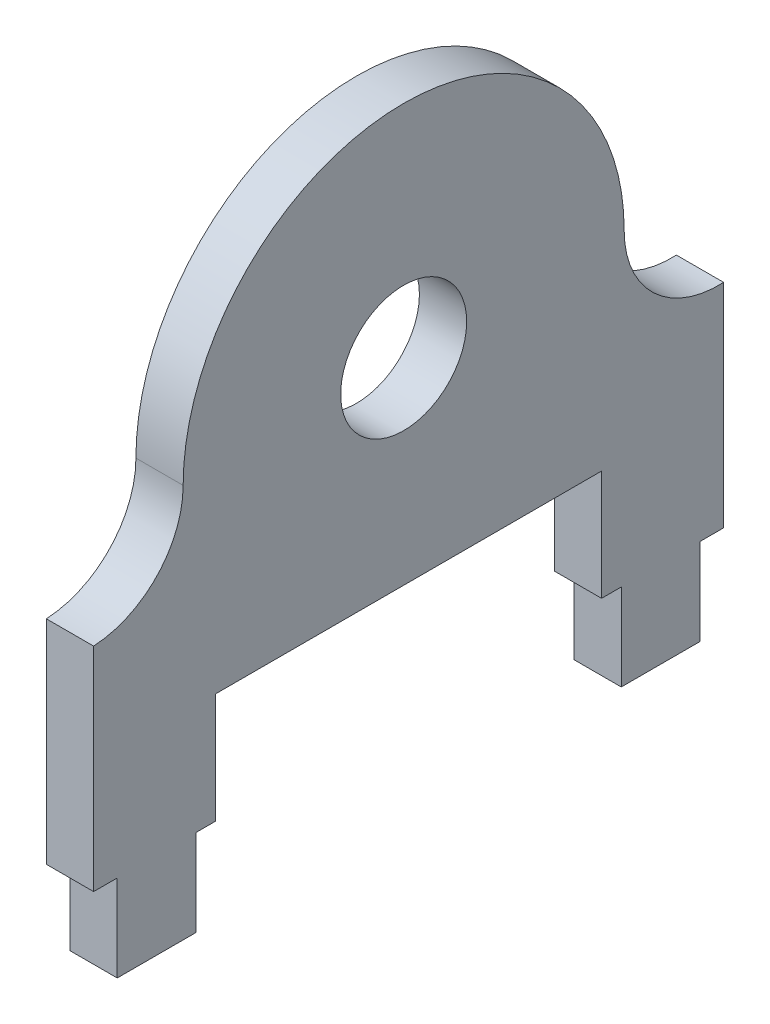
ISO-10303-21;
HEADER;
FILE_DESCRIPTION(('STEP AP214'),'2;1');
FILE_NAME('part.step','',(''),(''),'','','');
FILE_SCHEMA(('AUTOMOTIVE_DESIGN { 1 0 10303 214 1 1 1 1 }'));
ENDSEC;
DATA;
#1=APPLICATION_CONTEXT('core data for automotive mechanical design processes');
#2=APPLICATION_PROTOCOL_DEFINITION('international standard','automotive_design',2000,#1);
#3=PRODUCT_CONTEXT('',#1,'mechanical');
#4=PRODUCT('Part','Part','',(#3));
#5=PRODUCT_RELATED_PRODUCT_CATEGORY('part','',(#4));
#6=PRODUCT_DEFINITION_FORMATION('','',#4);
#7=PRODUCT_DEFINITION_CONTEXT('part definition',#1,'design');
#8=PRODUCT_DEFINITION('design','',#6,#7);
#9=PRODUCT_DEFINITION_SHAPE('','',#8);
#10=(LENGTH_UNIT() NAMED_UNIT(*) SI_UNIT(.MILLI.,.METRE.));
#11=(NAMED_UNIT(*) PLANE_ANGLE_UNIT() SI_UNIT($,.RADIAN.));
#12=(NAMED_UNIT(*) SI_UNIT($,.STERADIAN.) SOLID_ANGLE_UNIT());
#13=UNCERTAINTY_MEASURE_WITH_UNIT(LENGTH_MEASURE(1.E-05),#10,'distance_accuracy_value','');
#14=(GEOMETRIC_REPRESENTATION_CONTEXT(3) GLOBAL_UNCERTAINTY_ASSIGNED_CONTEXT((#13)) GLOBAL_UNIT_ASSIGNED_CONTEXT((#10,
#11,#12)) REPRESENTATION_CONTEXT('',''));
#15=CARTESIAN_POINT('',(0.,0.,0.));
#16=DIRECTION('',(0.,0.,1.));
#17=DIRECTION('',(1.,0.,0.));
#18=AXIS2_PLACEMENT_3D('',#15,#16,#17);
#19=CARTESIAN_POINT('',(3.,5.82382171329766,17.1432323268708));
#20=DIRECTION('',(1.,0.,0.));
#21=DIRECTION('',(0.,0.,-1.));
#22=AXIS2_PLACEMENT_3D('',#19,#20,#21);
#23=PLANE('',#22);
#24=CARTESIAN_POINT('',(3.,5.82382171329766,17.1432323268708));
#25=DIRECTION('',(-1.,0.,0.));
#26=DIRECTION('',(0.,0.,-1.));
#27=AXIS2_PLACEMENT_3D('',#24,#25,#26);
#28=CIRCLE('',#27,6.);
#29=CARTESIAN_POINT('',(3.,5.82630206498001,11.1432328395495));
#30=VERTEX_POINT('',#29);
#31=CARTESIAN_POINT('',(3.,-0.16791044776119,16.8283582089552));
#32=VERTEX_POINT('',#31);
#33=EDGE_CURVE('E234',#30,#32,#28,.T.);
#34=ORIENTED_EDGE('',*,*,#33,.T.);
#35=DIRECTION('',(0.,-1.,0.));
#36=VECTOR('',#35,1.);
#37=CARTESIAN_POINT('',(3.,-0.16791044776119,16.8283582089552));
#38=LINE('',#37,#36);
#39=CARTESIAN_POINT('',(3.,-13.6679104477612,16.8283582089552));
#40=VERTEX_POINT('',#39);
#41=EDGE_CURVE('E132',#32,#40,#38,.T.);
#42=ORIENTED_EDGE('',*,*,#41,.T.);
#43=DIRECTION('',(0.,0.,-1.));
#44=VECTOR('',#43,1.);
#45=CARTESIAN_POINT('',(3.,-13.6679104477612,16.8283582089552));
#46=LINE('',#45,#44);
#47=CARTESIAN_POINT('',(3.,-13.6679104477612,15.3283582089552));
#48=VERTEX_POINT('',#47);
#49=EDGE_CURVE('E279',#40,#48,#46,.T.);
#50=ORIENTED_EDGE('',*,*,#49,.T.);
#51=DIRECTION('',(0.,-1.,0.));
#52=VECTOR('',#51,1.);
#53=CARTESIAN_POINT('',(3.,-13.6679104477612,15.3283582089552));
#54=LINE('',#53,#52);
#55=CARTESIAN_POINT('',(3.,-19.1679104477612,15.3283582089552));
#56=VERTEX_POINT('',#55);
#57=EDGE_CURVE('E298',#48,#56,#54,.T.);
#58=ORIENTED_EDGE('',*,*,#57,.T.);
#59=DIRECTION('',(0.,0.,-1.));
#60=VECTOR('',#59,1.);
#61=CARTESIAN_POINT('',(3.,-19.1679104477612,15.3283582089552));
#62=LINE('',#61,#60);
#63=CARTESIAN_POINT('',(3.,-19.1679104477612,10.3283582089552));
#64=VERTEX_POINT('',#63);
#65=EDGE_CURVE('E295',#56,#64,#62,.T.);
#66=ORIENTED_EDGE('',*,*,#65,.T.);
#67=DIRECTION('',(0.,1.,0.));
#68=VECTOR('',#67,1.);
#69=CARTESIAN_POINT('',(3.,-19.1679104477612,10.3283582089552));
#70=LINE('',#69,#68);
#71=CARTESIAN_POINT('',(3.,-13.6679104477612,10.3283582089552));
#72=VERTEX_POINT('',#71);
#73=EDGE_CURVE('E297',#64,#72,#70,.T.);
#74=ORIENTED_EDGE('',*,*,#73,.T.);
#75=DIRECTION('',(0.,0.,-1.));
#76=VECTOR('',#75,1.);
#77=CARTESIAN_POINT('',(3.,-13.6679104477612,10.3283582089552));
#78=LINE('',#77,#76);
#79=CARTESIAN_POINT('',(3.,-13.6679104477612,9.07835820895524));
#80=VERTEX_POINT('',#79);
#81=EDGE_CURVE('E300',#72,#80,#78,.T.);
#82=ORIENTED_EDGE('',*,*,#81,.T.);
#83=DIRECTION('',(0.,1.,0.));
#84=VECTOR('',#83,1.);
#85=CARTESIAN_POINT('',(3.,-13.6679104477612,9.07835820895524));
#86=LINE('',#85,#84);
#87=CARTESIAN_POINT('',(3.,-6.66791044776119,9.07835820895524));
#88=VERTEX_POINT('',#87);
#89=EDGE_CURVE('E306',#80,#88,#86,.T.);
#90=ORIENTED_EDGE('',*,*,#89,.T.);
#91=DIRECTION('',(0.,0.,-1.));
#92=VECTOR('',#91,1.);
#93=CARTESIAN_POINT('',(3.,-6.66791044776119,9.07835820895524));
#94=LINE('',#93,#92);
#95=CARTESIAN_POINT('',(3.,-6.66791044776119,-15.4216417910448));
#96=VERTEX_POINT('',#95);
#97=EDGE_CURVE('E308',#88,#96,#94,.T.);
#98=ORIENTED_EDGE('',*,*,#97,.T.);
#99=DIRECTION('',(0.,-1.,0.));
#100=VECTOR('',#99,1.);
#101=CARTESIAN_POINT('',(3.,-6.66791044776119,-15.4216417910448));
#102=LINE('',#101,#100);
#103=CARTESIAN_POINT('',(3.,-13.6679104477612,-15.4216417910448));
#104=VERTEX_POINT('',#103);
#105=EDGE_CURVE('E310',#96,#104,#102,.T.);
#106=ORIENTED_EDGE('',*,*,#105,.T.);
#107=DIRECTION('',(0.,0.,-1.));
#108=VECTOR('',#107,1.);
#109=CARTESIAN_POINT('',(3.,-13.6679104477612,-15.4216417910448));
#110=LINE('',#109,#108);
#111=CARTESIAN_POINT('',(3.,-13.6679104477612,-16.6716417910448));
#112=VERTEX_POINT('',#111);
#113=EDGE_CURVE('E312',#104,#112,#110,.T.);
#114=ORIENTED_EDGE('',*,*,#113,.T.);
#115=DIRECTION('',(0.,-1.,0.));
#116=VECTOR('',#115,1.);
#117=CARTESIAN_POINT('',(3.,-13.6679104477612,-16.6716417910448));
#118=LINE('',#117,#116);
#119=CARTESIAN_POINT('',(3.,-19.1679104477612,-16.6716417910448));
#120=VERTEX_POINT('',#119);
#121=EDGE_CURVE('E314',#112,#120,#118,.T.);
#122=ORIENTED_EDGE('',*,*,#121,.T.);
#123=DIRECTION('',(0.,0.,-1.));
#124=VECTOR('',#123,1.);
#125=CARTESIAN_POINT('',(3.,-19.1679104477612,-16.6716417910448));
#126=LINE('',#125,#124);
#127=CARTESIAN_POINT('',(3.,-19.1679104477612,-21.6716417910448));
#128=VERTEX_POINT('',#127);
#129=EDGE_CURVE('E316',#120,#128,#126,.T.);
#130=ORIENTED_EDGE('',*,*,#129,.T.);
#131=DIRECTION('',(0.,1.,0.));
#132=VECTOR('',#131,1.);
#133=CARTESIAN_POINT('',(3.,-19.1679104477612,-21.6716417910448));
#134=LINE('',#133,#132);
#135=CARTESIAN_POINT('',(3.,-13.6679104477612,-21.6716417910448));
#136=VERTEX_POINT('',#135);
#137=EDGE_CURVE('E318',#128,#136,#134,.T.);
#138=ORIENTED_EDGE('',*,*,#137,.T.);
#139=DIRECTION('',(0.,0.,-1.));
#140=VECTOR('',#139,1.);
#141=CARTESIAN_POINT('',(3.,-13.6679104477612,-21.6716417910448));
#142=LINE('',#141,#140);
#143=CARTESIAN_POINT('',(3.,-13.6679104477612,-23.1716417910448));
#144=VERTEX_POINT('',#143);
#145=EDGE_CURVE('E181',#136,#144,#142,.T.);
#146=ORIENTED_EDGE('',*,*,#145,.T.);
#147=DIRECTION('',(0.,1.,0.));
#148=VECTOR('',#147,1.);
#149=CARTESIAN_POINT('',(3.,-13.6679104477612,-23.1716417910448));
#150=LINE('',#149,#148);
#151=CARTESIAN_POINT('',(3.,-0.16791044776119,-23.1716417910448));
#152=VERTEX_POINT('',#151);
#153=EDGE_CURVE('E175',#144,#152,#150,.T.);
#154=ORIENTED_EDGE('',*,*,#153,.T.);
#155=CARTESIAN_POINT('',(3.,5.83208955223879,-22.8646162204086));
#156=DIRECTION('',(-1.,0.,0.));
#157=DIRECTION('',(0.,0.,1.));
#158=AXIS2_PLACEMENT_3D('',#155,#156,#157);
#159=CIRCLE('',#158,6.00785025620848);
#160=CARTESIAN_POINT('',(3.,5.83208955223879,-16.8567659642001));
#161=VERTEX_POINT('',#160);
#162=EDGE_CURVE('E179',#152,#161,#159,.T.);
#163=ORIENTED_EDGE('',*,*,#162,.T.);
#164=CARTESIAN_POINT('',(3.,5.83208955223881,-2.85676596420012));
#165=DIRECTION('',(1.,0.,0.));
#166=DIRECTION('',(0.,0.,-1.));
#167=AXIS2_PLACEMENT_3D('',#164,#165,#166);
#168=CIRCLE('',#167,14.);
#169=EDGE_CURVE('E59',#161,#30,#168,.T.);
#170=ORIENTED_EDGE('',*,*,#169,.T.);
#171=EDGE_LOOP('',(#34,#42,#50,#58,#66,#74,#82,#90,#98,#106,#114,#122,#130,#138,#146,#154,#163,#170));
#172=FACE_BOUND('',#171,.T.);
#173=CARTESIAN_POINT('',(3.,5.83208955223881,-2.85676596420012));
#174=DIRECTION('',(1.,0.,0.));
#175=DIRECTION('',(0.,0.,-1.));
#176=AXIS2_PLACEMENT_3D('',#173,#174,#175);
#177=CIRCLE('',#176,4.);
#178=CARTESIAN_POINT('',(3.,5.83208955223881,-6.85676596420012));
#179=VERTEX_POINT('',#178);
#180=EDGE_CURVE('E203',#179,#179,#177,.T.);
#181=ORIENTED_EDGE('',*,*,#180,.F.);
#182=EDGE_LOOP('',(#181));
#183=FACE_BOUND('',#182,.T.);
#184=ADVANCED_FACE('F42',(#172,#183),#23,.T.);
#185=CARTESIAN_POINT('',(0.,5.82382171329766,17.1432323268708));
#186=DIRECTION('',(1.,0.,0.));
#187=DIRECTION('',(0.,0.,-1.));
#188=AXIS2_PLACEMENT_3D('',#185,#186,#187);
#189=PLANE('',#188);
#190=CARTESIAN_POINT('',(0.,5.82382171329766,17.1432323268708));
#191=DIRECTION('',(-1.,0.,0.));
#192=DIRECTION('',(0.,0.,-1.));
#193=AXIS2_PLACEMENT_3D('',#190,#191,#192);
#194=CIRCLE('',#193,6.);
#195=CARTESIAN_POINT('',(0.,5.82630206498001,11.1432328395495));
#196=VERTEX_POINT('',#195);
#197=CARTESIAN_POINT('',(0.,-0.16791044776119,16.8283582089552));
#198=VERTEX_POINT('',#197);
#199=EDGE_CURVE('E199',#196,#198,#194,.T.);
#200=ORIENTED_EDGE('',*,*,#199,.F.);
#201=CARTESIAN_POINT('',(0.,5.83208955223881,-2.85676596420012));
#202=DIRECTION('',(1.,0.,0.));
#203=DIRECTION('',(0.,0.,-1.));
#204=AXIS2_PLACEMENT_3D('',#201,#202,#203);
#205=CIRCLE('',#204,14.);
#206=CARTESIAN_POINT('',(0.,5.83208955223879,-16.8567659642001));
#207=VERTEX_POINT('',#206);
#208=EDGE_CURVE('E124',#207,#196,#205,.T.);
#209=ORIENTED_EDGE('',*,*,#208,.F.);
#210=CARTESIAN_POINT('',(0.,5.83208955223879,-22.8646162204086));
#211=DIRECTION('',(-1.,0.,0.));
#212=DIRECTION('',(0.,0.,1.));
#213=AXIS2_PLACEMENT_3D('',#210,#211,#212);
#214=CIRCLE('',#213,6.00785025620848);
#215=CARTESIAN_POINT('',(0.,-0.16791044776119,-23.1716417910448));
#216=VERTEX_POINT('',#215);
#217=EDGE_CURVE('E118',#216,#207,#214,.T.);
#218=ORIENTED_EDGE('',*,*,#217,.F.);
#219=DIRECTION('',(0.,1.,0.));
#220=VECTOR('',#219,1.);
#221=CARTESIAN_POINT('',(0.,-13.6679104477612,-23.1716417910448));
#222=LINE('',#221,#220);
#223=CARTESIAN_POINT('',(0.,-13.6679104477612,-23.1716417910448));
#224=VERTEX_POINT('',#223);
#225=EDGE_CURVE('E189',#224,#216,#222,.T.);
#226=ORIENTED_EDGE('',*,*,#225,.F.);
#227=DIRECTION('',(0.,0.,-1.));
#228=VECTOR('',#227,1.);
#229=CARTESIAN_POINT('',(0.,-13.6679104477612,-21.6716417910448));
#230=LINE('',#229,#228);
#231=CARTESIAN_POINT('',(0.,-13.6679104477612,-21.6716417910448));
#232=VERTEX_POINT('',#231);
#233=EDGE_CURVE('E229',#232,#224,#230,.T.);
#234=ORIENTED_EDGE('',*,*,#233,.F.);
#235=DIRECTION('',(0.,1.,0.));
#236=VECTOR('',#235,1.);
#237=CARTESIAN_POINT('',(0.,-19.1679104477612,-21.6716417910448));
#238=LINE('',#237,#236);
#239=CARTESIAN_POINT('',(0.,-19.1679104477612,-21.6716417910448));
#240=VERTEX_POINT('',#239);
#241=EDGE_CURVE('E227',#240,#232,#238,.T.);
#242=ORIENTED_EDGE('',*,*,#241,.F.);
#243=DIRECTION('',(0.,0.,-1.));
#244=VECTOR('',#243,1.);
#245=CARTESIAN_POINT('',(0.,-19.1679104477612,-16.6716417910448));
#246=LINE('',#245,#244);
#247=CARTESIAN_POINT('',(0.,-19.1679104477612,-16.6716417910448));
#248=VERTEX_POINT('',#247);
#249=EDGE_CURVE('E225',#248,#240,#246,.T.);
#250=ORIENTED_EDGE('',*,*,#249,.F.);
#251=DIRECTION('',(0.,-1.,0.));
#252=VECTOR('',#251,1.);
#253=CARTESIAN_POINT('',(0.,-13.6679104477612,-16.6716417910448));
#254=LINE('',#253,#252);
#255=CARTESIAN_POINT('',(0.,-13.6679104477612,-16.6716417910448));
#256=VERTEX_POINT('',#255);
#257=EDGE_CURVE('E223',#256,#248,#254,.T.);
#258=ORIENTED_EDGE('',*,*,#257,.F.);
#259=DIRECTION('',(0.,0.,-1.));
#260=VECTOR('',#259,1.);
#261=CARTESIAN_POINT('',(0.,-13.6679104477612,-15.4216417910448));
#262=LINE('',#261,#260);
#263=CARTESIAN_POINT('',(0.,-13.6679104477612,-15.4216417910448));
#264=VERTEX_POINT('',#263);
#265=EDGE_CURVE('E221',#264,#256,#262,.T.);
#266=ORIENTED_EDGE('',*,*,#265,.F.);
#267=DIRECTION('',(0.,-1.,0.));
#268=VECTOR('',#267,1.);
#269=CARTESIAN_POINT('',(0.,-6.66791044776119,-15.4216417910448));
#270=LINE('',#269,#268);
#271=CARTESIAN_POINT('',(0.,-6.66791044776119,-15.4216417910448));
#272=VERTEX_POINT('',#271);
#273=EDGE_CURVE('E219',#272,#264,#270,.T.);
#274=ORIENTED_EDGE('',*,*,#273,.F.);
#275=DIRECTION('',(0.,0.,-1.));
#276=VECTOR('',#275,1.);
#277=CARTESIAN_POINT('',(0.,-6.66791044776119,9.07835820895524));
#278=LINE('',#277,#276);
#279=CARTESIAN_POINT('',(0.,-6.66791044776119,9.07835820895524));
#280=VERTEX_POINT('',#279);
#281=EDGE_CURVE('E217',#280,#272,#278,.T.);
#282=ORIENTED_EDGE('',*,*,#281,.F.);
#283=DIRECTION('',(0.,1.,0.));
#284=VECTOR('',#283,1.);
#285=CARTESIAN_POINT('',(0.,-13.6679104477612,9.07835820895524));
#286=LINE('',#285,#284);
#287=CARTESIAN_POINT('',(0.,-13.6679104477612,9.07835820895524));
#288=VERTEX_POINT('',#287);
#289=EDGE_CURVE('E215',#288,#280,#286,.T.);
#290=ORIENTED_EDGE('',*,*,#289,.F.);
#291=DIRECTION('',(0.,0.,-1.));
#292=VECTOR('',#291,1.);
#293=CARTESIAN_POINT('',(0.,-13.6679104477612,10.3283582089552));
#294=LINE('',#293,#292);
#295=CARTESIAN_POINT('',(0.,-13.6679104477612,10.3283582089552));
#296=VERTEX_POINT('',#295);
#297=EDGE_CURVE('E213',#296,#288,#294,.T.);
#298=ORIENTED_EDGE('',*,*,#297,.F.);
#299=DIRECTION('',(0.,1.,0.));
#300=VECTOR('',#299,1.);
#301=CARTESIAN_POINT('',(0.,-19.1679104477612,10.3283582089552));
#302=LINE('',#301,#300);
#303=CARTESIAN_POINT('',(0.,-19.1679104477612,10.3283582089552));
#304=VERTEX_POINT('',#303);
#305=EDGE_CURVE('E211',#304,#296,#302,.T.);
#306=ORIENTED_EDGE('',*,*,#305,.F.);
#307=DIRECTION('',(0.,0.,-1.));
#308=VECTOR('',#307,1.);
#309=CARTESIAN_POINT('',(0.,-19.1679104477612,15.3283582089552));
#310=LINE('',#309,#308);
#311=CARTESIAN_POINT('',(0.,-19.1679104477612,15.3283582089552));
#312=VERTEX_POINT('',#311);
#313=EDGE_CURVE('E209',#312,#304,#310,.T.);
#314=ORIENTED_EDGE('',*,*,#313,.F.);
#315=DIRECTION('',(0.,-1.,0.));
#316=VECTOR('',#315,1.);
#317=CARTESIAN_POINT('',(0.,-13.6679104477612,15.3283582089552));
#318=LINE('',#317,#316);
#319=CARTESIAN_POINT('',(0.,-13.6679104477612,15.3283582089552));
#320=VERTEX_POINT('',#319);
#321=EDGE_CURVE('E207',#320,#312,#318,.T.);
#322=ORIENTED_EDGE('',*,*,#321,.F.);
#323=DIRECTION('',(0.,0.,-1.));
#324=VECTOR('',#323,1.);
#325=CARTESIAN_POINT('',(0.,-13.6679104477612,16.8283582089552));
#326=LINE('',#325,#324);
#327=CARTESIAN_POINT('',(0.,-13.6679104477612,16.8283582089552));
#328=VERTEX_POINT('',#327);
#329=EDGE_CURVE('E205',#328,#320,#326,.T.);
#330=ORIENTED_EDGE('',*,*,#329,.F.);
#331=DIRECTION('',(0.,-1.,0.));
#332=VECTOR('',#331,1.);
#333=CARTESIAN_POINT('',(0.,-0.16791044776119,16.8283582089552));
#334=LINE('',#333,#332);
#335=EDGE_CURVE('E202',#198,#328,#334,.T.);
#336=ORIENTED_EDGE('',*,*,#335,.F.);
#337=EDGE_LOOP('',(#200,#209,#218,#226,#234,#242,#250,#258,#266,#274,#282,#290,#298,#306,#314,
#322,#330,#336));
#338=FACE_BOUND('',#337,.T.);
#339=CARTESIAN_POINT('',(0.,5.83208955223881,-2.85676596420012));
#340=DIRECTION('',(1.,0.,0.));
#341=DIRECTION('',(0.,0.,-1.));
#342=AXIS2_PLACEMENT_3D('',#339,#340,#341);
#343=CIRCLE('',#342,4.);
#344=CARTESIAN_POINT('',(0.,5.83208955223881,-6.85676596420012));
#345=VERTEX_POINT('',#344);
#346=EDGE_CURVE('E587',#345,#345,#343,.T.);
#347=ORIENTED_EDGE('',*,*,#346,.T.);
#348=EDGE_LOOP('',(#347));
#349=FACE_BOUND('',#348,.T.);
#350=ADVANCED_FACE('F283',(#338,#349),#189,.F.);
#351=CARTESIAN_POINT('',(3.,5.82382171329766,17.1432323268708));
#352=DIRECTION('',(-1.,0.,0.));
#353=DIRECTION('',(0.,0.,1.));
#354=AXIS2_PLACEMENT_3D('',#351,#352,#353);
#355=CYLINDRICAL_SURFACE('',#354,6.);
#356=ORIENTED_EDGE('',*,*,#199,.T.);
#357=DIRECTION('',(-1.,0.,0.));
#358=VECTOR('',#357,1.);
#359=CARTESIAN_POINT('',(3.,-0.16791044776119,16.8283582089552));
#360=LINE('',#359,#358);
#361=EDGE_CURVE('E11',#32,#198,#360,.T.);
#362=ORIENTED_EDGE('',*,*,#361,.F.);
#363=ORIENTED_EDGE('',*,*,#33,.F.);
#364=DIRECTION('',(-1.,0.,0.));
#365=VECTOR('',#364,1.);
#366=CARTESIAN_POINT('',(3.,5.82630206498001,11.1432328395495));
#367=LINE('',#366,#365);
#368=EDGE_CURVE('E195',#30,#196,#367,.T.);
#369=ORIENTED_EDGE('',*,*,#368,.T.);
#370=EDGE_LOOP('',(#356,#362,#363,#369));
#371=FACE_BOUND('',#370,.T.);
#372=ADVANCED_FACE('F44',(#371),#355,.F.);
#373=CARTESIAN_POINT('',(3.,-0.16791044776119,16.8283582089552));
#374=DIRECTION('',(0.,0.,-1.));
#375=DIRECTION('',(0.,1.,0.));
#376=AXIS2_PLACEMENT_3D('',#373,#374,#375);
#377=PLANE('',#376);
#378=ORIENTED_EDGE('',*,*,#335,.T.);
#379=DIRECTION('',(-1.,0.,0.));
#380=VECTOR('',#379,1.);
#381=CARTESIAN_POINT('',(3.,-13.6679104477612,16.8283582089552));
#382=LINE('',#381,#380);
#383=EDGE_CURVE('E51',#40,#328,#382,.T.);
#384=ORIENTED_EDGE('',*,*,#383,.F.);
#385=ORIENTED_EDGE('',*,*,#41,.F.);
#386=ORIENTED_EDGE('',*,*,#361,.T.);
#387=EDGE_LOOP('',(#378,#384,#385,#386));
#388=FACE_BOUND('',#387,.T.);
#389=ADVANCED_FACE('F352',(#388),#377,.F.);
#390=CARTESIAN_POINT('',(3.,-13.6679104477612,16.8283582089552));
#391=DIRECTION('',(0.,1.,0.));
#392=DIRECTION('',(0.,0.,1.));
#393=AXIS2_PLACEMENT_3D('',#390,#391,#392);
#394=PLANE('',#393);
#395=ORIENTED_EDGE('',*,*,#329,.T.);
#396=DIRECTION('',(-1.,0.,0.));
#397=VECTOR('',#396,1.);
#398=CARTESIAN_POINT('',(3.,-13.6679104477612,15.3283582089552));
#399=LINE('',#398,#397);
#400=EDGE_CURVE('E271',#48,#320,#399,.T.);
#401=ORIENTED_EDGE('',*,*,#400,.F.);
#402=ORIENTED_EDGE('',*,*,#49,.F.);
#403=ORIENTED_EDGE('',*,*,#383,.T.);
#404=EDGE_LOOP('',(#395,#401,#402,#403));
#405=FACE_BOUND('',#404,.T.);
#406=ADVANCED_FACE('F277',(#405),#394,.F.);
#407=CARTESIAN_POINT('',(3.,-13.6679104477612,15.3283582089552));
#408=DIRECTION('',(0.,0.,-1.));
#409=DIRECTION('',(-1.,0.,0.));
#410=AXIS2_PLACEMENT_3D('',#407,#408,#409);
#411=PLANE('',#410);
#412=ORIENTED_EDGE('',*,*,#321,.T.);
#413=DIRECTION('',(-1.,0.,0.));
#414=VECTOR('',#413,1.);
#415=CARTESIAN_POINT('',(3.,-19.1679104477612,15.3283582089552));
#416=LINE('',#415,#414);
#417=EDGE_CURVE('E268',#56,#312,#416,.T.);
#418=ORIENTED_EDGE('',*,*,#417,.F.);
#419=ORIENTED_EDGE('',*,*,#57,.F.);
#420=ORIENTED_EDGE('',*,*,#400,.T.);
#421=EDGE_LOOP('',(#412,#418,#419,#420));
#422=FACE_BOUND('',#421,.T.);
#423=ADVANCED_FACE('F289',(#422),#411,.F.);
#424=CARTESIAN_POINT('',(3.,-19.1679104477612,15.3283582089552));
#425=DIRECTION('',(0.,1.,0.));
#426=DIRECTION('',(0.,0.,1.));
#427=AXIS2_PLACEMENT_3D('',#424,#425,#426);
#428=PLANE('',#427);
#429=ORIENTED_EDGE('',*,*,#313,.T.);
#430=DIRECTION('',(-1.,0.,0.));
#431=VECTOR('',#430,1.);
#432=CARTESIAN_POINT('',(3.,-19.1679104477612,10.3283582089552));
#433=LINE('',#432,#431);
#434=EDGE_CURVE('E265',#64,#304,#433,.T.);
#435=ORIENTED_EDGE('',*,*,#434,.F.);
#436=ORIENTED_EDGE('',*,*,#65,.F.);
#437=ORIENTED_EDGE('',*,*,#417,.T.);
#438=EDGE_LOOP('',(#429,#435,#436,#437));
#439=FACE_BOUND('',#438,.T.);
#440=ADVANCED_FACE('F293',(#439),#428,.F.);
#441=CARTESIAN_POINT('',(3.,-19.1679104477612,10.3283582089552));
#442=DIRECTION('',(0.,0.,1.));
#443=DIRECTION('',(1.,0.,0.));
#444=AXIS2_PLACEMENT_3D('',#441,#442,#443);
#445=PLANE('',#444);
#446=ORIENTED_EDGE('',*,*,#305,.T.);
#447=DIRECTION('',(-1.,0.,0.));
#448=VECTOR('',#447,1.);
#449=CARTESIAN_POINT('',(3.,-13.6679104477612,10.3283582089552));
#450=LINE('',#449,#448);
#451=EDGE_CURVE('E262',#72,#296,#450,.T.);
#452=ORIENTED_EDGE('',*,*,#451,.F.);
#453=ORIENTED_EDGE('',*,*,#73,.F.);
#454=ORIENTED_EDGE('',*,*,#434,.T.);
#455=EDGE_LOOP('',(#446,#452,#453,#454));
#456=FACE_BOUND('',#455,.T.);
#457=ADVANCED_FACE('F365',(#456),#445,.F.);
#458=CARTESIAN_POINT('',(3.,-13.6679104477612,10.3283582089552));
#459=DIRECTION('',(0.,1.,0.));
#460=DIRECTION('',(0.,0.,1.));
#461=AXIS2_PLACEMENT_3D('',#458,#459,#460);
#462=PLANE('',#461);
#463=ORIENTED_EDGE('',*,*,#297,.T.);
#464=DIRECTION('',(-1.,0.,0.));
#465=VECTOR('',#464,1.);
#466=CARTESIAN_POINT('',(3.,-13.6679104477612,9.07835820895524));
#467=LINE('',#466,#465);
#468=EDGE_CURVE('E259',#80,#288,#467,.T.);
#469=ORIENTED_EDGE('',*,*,#468,.F.);
#470=ORIENTED_EDGE('',*,*,#81,.F.);
#471=ORIENTED_EDGE('',*,*,#451,.T.);
#472=EDGE_LOOP('',(#463,#469,#470,#471));
#473=FACE_BOUND('',#472,.T.);
#474=ADVANCED_FACE('F368',(#473),#462,.F.);
#475=CARTESIAN_POINT('',(3.,-13.6679104477612,9.07835820895524));
#476=DIRECTION('',(0.,0.,1.));
#477=DIRECTION('',(1.,0.,0.));
#478=AXIS2_PLACEMENT_3D('',#475,#476,#477);
#479=PLANE('',#478);
#480=ORIENTED_EDGE('',*,*,#289,.T.);
#481=DIRECTION('',(-1.,0.,0.));
#482=VECTOR('',#481,1.);
#483=CARTESIAN_POINT('',(3.,-6.66791044776119,9.07835820895524));
#484=LINE('',#483,#482);
#485=EDGE_CURVE('E256',#88,#280,#484,.T.);
#486=ORIENTED_EDGE('',*,*,#485,.F.);
#487=ORIENTED_EDGE('',*,*,#89,.F.);
#488=ORIENTED_EDGE('',*,*,#468,.T.);
#489=EDGE_LOOP('',(#480,#486,#487,#488));
#490=FACE_BOUND('',#489,.T.);
#491=ADVANCED_FACE('F372',(#490),#479,.F.);
#492=CARTESIAN_POINT('',(3.,-6.66791044776119,9.07835820895524));
#493=DIRECTION('',(0.,1.,0.));
#494=DIRECTION('',(0.,0.,1.));
#495=AXIS2_PLACEMENT_3D('',#492,#493,#494);
#496=PLANE('',#495);
#497=ORIENTED_EDGE('',*,*,#281,.T.);
#498=DIRECTION('',(-1.,0.,0.));
#499=VECTOR('',#498,1.);
#500=CARTESIAN_POINT('',(3.,-6.66791044776119,-15.4216417910448));
#501=LINE('',#500,#499);
#502=EDGE_CURVE('E253',#96,#272,#501,.T.);
#503=ORIENTED_EDGE('',*,*,#502,.F.);
#504=ORIENTED_EDGE('',*,*,#97,.F.);
#505=ORIENTED_EDGE('',*,*,#485,.T.);
#506=EDGE_LOOP('',(#497,#503,#504,#505));
#507=FACE_BOUND('',#506,.T.);
#508=ADVANCED_FACE('F376',(#507),#496,.F.);
#509=CARTESIAN_POINT('',(3.,-6.66791044776119,-15.4216417910448));
#510=DIRECTION('',(0.,0.,-1.));
#511=DIRECTION('',(0.,1.,0.));
#512=AXIS2_PLACEMENT_3D('',#509,#510,#511);
#513=PLANE('',#512);
#514=ORIENTED_EDGE('',*,*,#273,.T.);
#515=DIRECTION('',(-1.,0.,0.));
#516=VECTOR('',#515,1.);
#517=CARTESIAN_POINT('',(3.,-13.6679104477612,-15.4216417910448));
#518=LINE('',#517,#516);
#519=EDGE_CURVE('E250',#104,#264,#518,.T.);
#520=ORIENTED_EDGE('',*,*,#519,.F.);
#521=ORIENTED_EDGE('',*,*,#105,.F.);
#522=ORIENTED_EDGE('',*,*,#502,.T.);
#523=EDGE_LOOP('',(#514,#520,#521,#522));
#524=FACE_BOUND('',#523,.T.);
#525=ADVANCED_FACE('F380',(#524),#513,.F.);
#526=CARTESIAN_POINT('',(3.,-13.6679104477612,-15.4216417910448));
#527=DIRECTION('',(0.,1.,0.));
#528=DIRECTION('',(0.,0.,1.));
#529=AXIS2_PLACEMENT_3D('',#526,#527,#528);
#530=PLANE('',#529);
#531=ORIENTED_EDGE('',*,*,#265,.T.);
#532=DIRECTION('',(-1.,0.,0.));
#533=VECTOR('',#532,1.);
#534=CARTESIAN_POINT('',(3.,-13.6679104477612,-16.6716417910448));
#535=LINE('',#534,#533);
#536=EDGE_CURVE('E247',#112,#256,#535,.T.);
#537=ORIENTED_EDGE('',*,*,#536,.F.);
#538=ORIENTED_EDGE('',*,*,#113,.F.);
#539=ORIENTED_EDGE('',*,*,#519,.T.);
#540=EDGE_LOOP('',(#531,#537,#538,#539));
#541=FACE_BOUND('',#540,.T.);
#542=ADVANCED_FACE('F384',(#541),#530,.F.);
#543=CARTESIAN_POINT('',(3.,-13.6679104477612,-16.6716417910448));
#544=DIRECTION('',(0.,0.,-1.));
#545=DIRECTION('',(-1.,0.,0.));
#546=AXIS2_PLACEMENT_3D('',#543,#544,#545);
#547=PLANE('',#546);
#548=ORIENTED_EDGE('',*,*,#257,.T.);
#549=DIRECTION('',(-1.,0.,0.));
#550=VECTOR('',#549,1.);
#551=CARTESIAN_POINT('',(3.,-19.1679104477612,-16.6716417910448));
#552=LINE('',#551,#550);
#553=EDGE_CURVE('E244',#120,#248,#552,.T.);
#554=ORIENTED_EDGE('',*,*,#553,.F.);
#555=ORIENTED_EDGE('',*,*,#121,.F.);
#556=ORIENTED_EDGE('',*,*,#536,.T.);
#557=EDGE_LOOP('',(#548,#554,#555,#556));
#558=FACE_BOUND('',#557,.T.);
#559=ADVANCED_FACE('F388',(#558),#547,.F.);
#560=CARTESIAN_POINT('',(3.,-19.1679104477612,-16.6716417910448));
#561=DIRECTION('',(0.,1.,0.));
#562=DIRECTION('',(0.,0.,1.));
#563=AXIS2_PLACEMENT_3D('',#560,#561,#562);
#564=PLANE('',#563);
#565=ORIENTED_EDGE('',*,*,#249,.T.);
#566=DIRECTION('',(-1.,0.,0.));
#567=VECTOR('',#566,1.);
#568=CARTESIAN_POINT('',(3.,-19.1679104477612,-21.6716417910448));
#569=LINE('',#568,#567);
#570=EDGE_CURVE('E241',#128,#240,#569,.T.);
#571=ORIENTED_EDGE('',*,*,#570,.F.);
#572=ORIENTED_EDGE('',*,*,#129,.F.);
#573=ORIENTED_EDGE('',*,*,#553,.T.);
#574=EDGE_LOOP('',(#565,#571,#572,#573));
#575=FACE_BOUND('',#574,.T.);
#576=ADVANCED_FACE('F392',(#575),#564,.F.);
#577=CARTESIAN_POINT('',(3.,-19.1679104477612,-21.6716417910448));
#578=DIRECTION('',(0.,0.,1.));
#579=DIRECTION('',(1.,0.,0.));
#580=AXIS2_PLACEMENT_3D('',#577,#578,#579);
#581=PLANE('',#580);
#582=ORIENTED_EDGE('',*,*,#241,.T.);
#583=DIRECTION('',(-1.,0.,0.));
#584=VECTOR('',#583,1.);
#585=CARTESIAN_POINT('',(3.,-13.6679104477612,-21.6716417910448));
#586=LINE('',#585,#584);
#587=EDGE_CURVE('E238',#136,#232,#586,.T.);
#588=ORIENTED_EDGE('',*,*,#587,.F.);
#589=ORIENTED_EDGE('',*,*,#137,.F.);
#590=ORIENTED_EDGE('',*,*,#570,.T.);
#591=EDGE_LOOP('',(#582,#588,#589,#590));
#592=FACE_BOUND('',#591,.T.);
#593=ADVANCED_FACE('F324',(#592),#581,.F.);
#594=CARTESIAN_POINT('',(3.,-13.6679104477612,-21.6716417910448));
#595=DIRECTION('',(0.,1.,0.));
#596=DIRECTION('',(0.,0.,1.));
#597=AXIS2_PLACEMENT_3D('',#594,#595,#596);
#598=PLANE('',#597);
#599=ORIENTED_EDGE('',*,*,#233,.T.);
#600=DIRECTION('',(-1.,0.,0.));
#601=VECTOR('',#600,1.);
#602=CARTESIAN_POINT('',(3.,-13.6679104477612,-23.1716417910448));
#603=LINE('',#602,#601);
#604=EDGE_CURVE('E190',#144,#224,#603,.T.);
#605=ORIENTED_EDGE('',*,*,#604,.F.);
#606=ORIENTED_EDGE('',*,*,#145,.F.);
#607=ORIENTED_EDGE('',*,*,#587,.T.);
#608=EDGE_LOOP('',(#599,#605,#606,#607));
#609=FACE_BOUND('',#608,.T.);
#610=ADVANCED_FACE('F328',(#609),#598,.F.);
#611=CARTESIAN_POINT('',(3.,-13.6679104477612,-23.1716417910448));
#612=DIRECTION('',(0.,0.,1.));
#613=DIRECTION('',(0.,-1.,0.));
#614=AXIS2_PLACEMENT_3D('',#611,#612,#613);
#615=PLANE('',#614);
#616=ORIENTED_EDGE('',*,*,#225,.T.);
#617=DIRECTION('',(-1.,0.,0.));
#618=VECTOR('',#617,1.);
#619=CARTESIAN_POINT('',(3.,-0.16791044776119,-23.1716417910448));
#620=LINE('',#619,#618);
#621=EDGE_CURVE('E186',#152,#216,#620,.T.);
#622=ORIENTED_EDGE('',*,*,#621,.F.);
#623=ORIENTED_EDGE('',*,*,#153,.F.);
#624=ORIENTED_EDGE('',*,*,#604,.T.);
#625=EDGE_LOOP('',(#616,#622,#623,#624));
#626=FACE_BOUND('',#625,.T.);
#627=ADVANCED_FACE('F187',(#626),#615,.F.);
#628=CARTESIAN_POINT('',(3.,5.83208955223879,-22.8646162204086));
#629=DIRECTION('',(-1.,0.,0.));
#630=DIRECTION('',(0.,0.,1.));
#631=AXIS2_PLACEMENT_3D('',#628,#629,#630);
#632=CYLINDRICAL_SURFACE('',#631,6.00785025620848);
#633=ORIENTED_EDGE('',*,*,#217,.T.);
#634=DIRECTION('',(-1.,0.,0.));
#635=VECTOR('',#634,1.);
#636=CARTESIAN_POINT('',(3.,5.83208955223879,-16.8567659642001));
#637=LINE('',#636,#635);
#638=EDGE_CURVE('E191',#161,#207,#637,.T.);
#639=ORIENTED_EDGE('',*,*,#638,.F.);
#640=ORIENTED_EDGE('',*,*,#162,.F.);
#641=ORIENTED_EDGE('',*,*,#621,.T.);
#642=EDGE_LOOP('',(#633,#639,#640,#641));
#643=FACE_BOUND('',#642,.T.);
#644=ADVANCED_FACE('F193',(#643),#632,.F.);
#645=CARTESIAN_POINT('',(3.,5.83208955223881,-2.85676596420012));
#646=DIRECTION('',(-1.,0.,0.));
#647=DIRECTION('',(0.,0.,1.));
#648=AXIS2_PLACEMENT_3D('',#645,#646,#647);
#649=CYLINDRICAL_SURFACE('',#648,14.);
#650=ORIENTED_EDGE('',*,*,#208,.T.);
#651=ORIENTED_EDGE('',*,*,#368,.F.);
#652=ORIENTED_EDGE('',*,*,#169,.F.);
#653=ORIENTED_EDGE('',*,*,#638,.T.);
#654=EDGE_LOOP('',(#650,#651,#652,#653));
#655=FACE_BOUND('',#654,.T.);
#656=ADVANCED_FACE('F332',(#655),#649,.T.);
#657=CARTESIAN_POINT('',(3.,5.83208955223881,-2.85676596420012));
#658=DIRECTION('',(-1.,0.,0.));
#659=DIRECTION('',(0.,0.,1.));
#660=AXIS2_PLACEMENT_3D('',#657,#658,#659);
#661=CYLINDRICAL_SURFACE('',#660,4.);
#662=ORIENTED_EDGE('',*,*,#180,.T.);
#663=EDGE_LOOP('',(#662));
#664=FACE_BOUND('',#663,.T.);
#665=ORIENTED_EDGE('',*,*,#346,.F.);
#666=EDGE_LOOP('',(#665));
#667=FACE_BOUND('',#666,.T.);
#668=ADVANCED_FACE('F334',(#664,#667),#661,.F.);
#669=CLOSED_SHELL('',(#184,#350,#372,#389,#406,#423,#440,#457,#474,#491,#508,#525,#542,#559,
#576,#593,#610,#627,#644,#656,#668));
#670=MANIFOLD_SOLID_BREP('B2',#669);
#671=ADVANCED_BREP_SHAPE_REPRESENTATION('',(#18,#670),#14);
#672=SHAPE_DEFINITION_REPRESENTATION(#9,#671);
ENDSEC;
END-ISO-10303-21;
